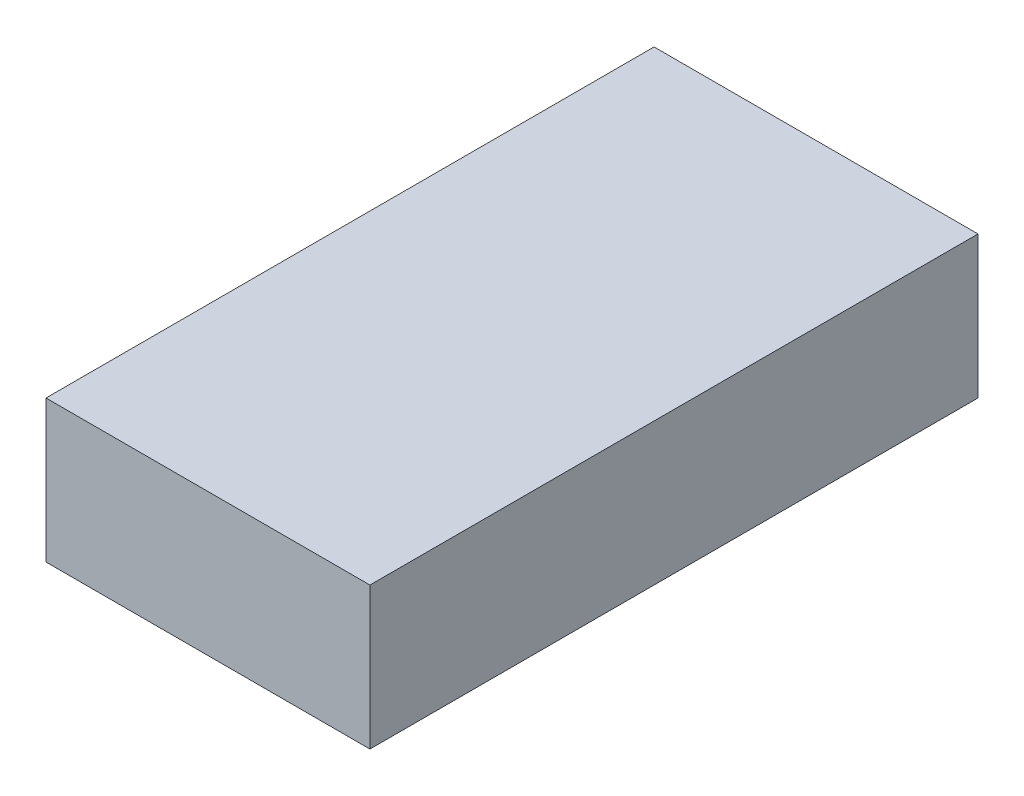
ISO-10303-21;
HEADER;
FILE_DESCRIPTION(('STEP AP214'),'2;1');
FILE_NAME('part.step','',(''),(''),'','','');
FILE_SCHEMA(('AUTOMOTIVE_DESIGN { 1 0 10303 214 1 1 1 1 }'));
ENDSEC;
DATA;
#1=APPLICATION_CONTEXT('core data for automotive mechanical design processes');
#2=APPLICATION_PROTOCOL_DEFINITION('international standard','automotive_design',2000,#1);
#3=PRODUCT_CONTEXT('',#1,'mechanical');
#4=PRODUCT('Part','Part','',(#3));
#5=PRODUCT_RELATED_PRODUCT_CATEGORY('part','',(#4));
#6=PRODUCT_DEFINITION_FORMATION('','',#4);
#7=PRODUCT_DEFINITION_CONTEXT('part definition',#1,'design');
#8=PRODUCT_DEFINITION('design','',#6,#7);
#9=PRODUCT_DEFINITION_SHAPE('','',#8);
#10=(LENGTH_UNIT() NAMED_UNIT(*) SI_UNIT(.MILLI.,.METRE.));
#11=(NAMED_UNIT(*) PLANE_ANGLE_UNIT() SI_UNIT($,.RADIAN.));
#12=(NAMED_UNIT(*) SI_UNIT($,.STERADIAN.) SOLID_ANGLE_UNIT());
#13=UNCERTAINTY_MEASURE_WITH_UNIT(LENGTH_MEASURE(1.E-05),#10,'distance_accuracy_value','');
#14=(GEOMETRIC_REPRESENTATION_CONTEXT(3) GLOBAL_UNCERTAINTY_ASSIGNED_CONTEXT((#13)) GLOBAL_UNIT_ASSIGNED_CONTEXT((#10,
#11,#12)) REPRESENTATION_CONTEXT('',''));
#15=CARTESIAN_POINT('',(0.,0.,0.));
#16=DIRECTION('',(0.,0.,1.));
#17=DIRECTION('',(1.,0.,0.));
#18=AXIS2_PLACEMENT_3D('',#15,#16,#17);
#19=CARTESIAN_POINT('',(-57.,-25.,214.));
#20=DIRECTION('',(1.,0.,0.));
#21=DIRECTION('',(0.,0.,-1.));
#22=AXIS2_PLACEMENT_3D('',#19,#20,#21);
#23=PLANE('',#22);
#24=DIRECTION('',(0.,-1.,0.));
#25=VECTOR('',#24,1.);
#26=CARTESIAN_POINT('',(-57.,-25.,0.));
#27=LINE('',#26,#25);
#28=CARTESIAN_POINT('',(-57.,25.,0.));
#29=VERTEX_POINT('',#28);
#30=CARTESIAN_POINT('',(-57.,-25.,0.));
#31=VERTEX_POINT('',#30);
#32=EDGE_CURVE('E96',#29,#31,#27,.T.);
#33=ORIENTED_EDGE('',*,*,#32,.T.);
#34=DIRECTION('',(0.,0.,-1.));
#35=VECTOR('',#34,1.);
#36=CARTESIAN_POINT('',(-57.,-25.,214.));
#37=LINE('',#36,#35);
#38=CARTESIAN_POINT('',(-57.,-25.,214.));
#39=VERTEX_POINT('',#38);
#40=EDGE_CURVE('E11',#39,#31,#37,.T.);
#41=ORIENTED_EDGE('',*,*,#40,.F.);
#42=DIRECTION('',(0.,-1.,0.));
#43=VECTOR('',#42,1.);
#44=CARTESIAN_POINT('',(-57.,-25.,214.));
#45=LINE('',#44,#43);
#46=CARTESIAN_POINT('',(-57.,25.,214.));
#47=VERTEX_POINT('',#46);
#48=EDGE_CURVE('E84',#47,#39,#45,.T.);
#49=ORIENTED_EDGE('',*,*,#48,.F.);
#50=DIRECTION('',(0.,0.,-1.));
#51=VECTOR('',#50,1.);
#52=CARTESIAN_POINT('',(-57.,25.,214.));
#53=LINE('',#52,#51);
#54=EDGE_CURVE('E92',#47,#29,#53,.T.);
#55=ORIENTED_EDGE('',*,*,#54,.T.);
#56=EDGE_LOOP('',(#33,#41,#49,#55));
#57=FACE_BOUND('',#56,.T.);
#58=ADVANCED_FACE('F33',(#57),#23,.F.);
#59=CARTESIAN_POINT('',(57.,-25.,214.));
#60=DIRECTION('',(0.,1.,0.));
#61=DIRECTION('',(-1.,0.,0.));
#62=AXIS2_PLACEMENT_3D('',#59,#60,#61);
#63=PLANE('',#62);
#64=DIRECTION('',(1.,0.,0.));
#65=VECTOR('',#64,1.);
#66=CARTESIAN_POINT('',(57.,-25.,0.));
#67=LINE('',#66,#65);
#68=CARTESIAN_POINT('',(57.,-25.,0.));
#69=VERTEX_POINT('',#68);
#70=EDGE_CURVE('E88',#31,#69,#67,.T.);
#71=ORIENTED_EDGE('',*,*,#70,.T.);
#72=DIRECTION('',(0.,0.,-1.));
#73=VECTOR('',#72,1.);
#74=CARTESIAN_POINT('',(57.,-25.,214.));
#75=LINE('',#74,#73);
#76=CARTESIAN_POINT('',(57.,-25.,214.));
#77=VERTEX_POINT('',#76);
#78=EDGE_CURVE('E41',#77,#69,#75,.T.);
#79=ORIENTED_EDGE('',*,*,#78,.F.);
#80=DIRECTION('',(1.,0.,0.));
#81=VECTOR('',#80,1.);
#82=CARTESIAN_POINT('',(57.,-25.,214.));
#83=LINE('',#82,#81);
#84=EDGE_CURVE('E79',#39,#77,#83,.T.);
#85=ORIENTED_EDGE('',*,*,#84,.F.);
#86=ORIENTED_EDGE('',*,*,#40,.T.);
#87=EDGE_LOOP('',(#71,#79,#85,#86));
#88=FACE_BOUND('',#87,.T.);
#89=ADVANCED_FACE('F87',(#88),#63,.F.);
#90=CARTESIAN_POINT('',(57.,-25.,214.));
#91=DIRECTION('',(-1.,0.,0.));
#92=DIRECTION('',(0.,0.,1.));
#93=AXIS2_PLACEMENT_3D('',#90,#91,#92);
#94=PLANE('',#93);
#95=DIRECTION('',(0.,1.,0.));
#96=VECTOR('',#95,1.);
#97=CARTESIAN_POINT('',(57.,-25.,0.));
#98=LINE('',#97,#96);
#99=CARTESIAN_POINT('',(57.,25.,0.));
#100=VERTEX_POINT('',#99);
#101=EDGE_CURVE('E66',#69,#100,#98,.T.);
#102=ORIENTED_EDGE('',*,*,#101,.T.);
#103=DIRECTION('',(0.,0.,-1.));
#104=VECTOR('',#103,1.);
#105=CARTESIAN_POINT('',(57.,25.,214.));
#106=LINE('',#105,#104);
#107=CARTESIAN_POINT('',(57.,25.,214.));
#108=VERTEX_POINT('',#107);
#109=EDGE_CURVE('E89',#108,#100,#106,.T.);
#110=ORIENTED_EDGE('',*,*,#109,.F.);
#111=DIRECTION('',(0.,1.,0.));
#112=VECTOR('',#111,1.);
#113=CARTESIAN_POINT('',(57.,-25.,214.));
#114=LINE('',#113,#112);
#115=EDGE_CURVE('E82',#77,#108,#114,.T.);
#116=ORIENTED_EDGE('',*,*,#115,.F.);
#117=ORIENTED_EDGE('',*,*,#78,.T.);
#118=EDGE_LOOP('',(#102,#110,#116,#117));
#119=FACE_BOUND('',#118,.T.);
#120=ADVANCED_FACE('F90',(#119),#94,.F.);
#121=CARTESIAN_POINT('',(57.,25.,214.));
#122=DIRECTION('',(0.,-1.,0.));
#123=DIRECTION('',(1.,0.,0.));
#124=AXIS2_PLACEMENT_3D('',#121,#122,#123);
#125=PLANE('',#124);
#126=DIRECTION('',(-1.,0.,0.));
#127=VECTOR('',#126,1.);
#128=CARTESIAN_POINT('',(57.,25.,0.));
#129=LINE('',#128,#127);
#130=EDGE_CURVE('E72',#100,#29,#129,.T.);
#131=ORIENTED_EDGE('',*,*,#130,.T.);
#132=ORIENTED_EDGE('',*,*,#54,.F.);
#133=DIRECTION('',(-1.,0.,0.));
#134=VECTOR('',#133,1.);
#135=CARTESIAN_POINT('',(57.,25.,214.));
#136=LINE('',#135,#134);
#137=EDGE_CURVE('E49',#108,#47,#136,.T.);
#138=ORIENTED_EDGE('',*,*,#137,.F.);
#139=ORIENTED_EDGE('',*,*,#109,.T.);
#140=EDGE_LOOP('',(#131,#132,#138,#139));
#141=FACE_BOUND('',#140,.T.);
#142=ADVANCED_FACE('F103',(#141),#125,.F.);
#143=CARTESIAN_POINT('',(0.,0.,214.));
#144=DIRECTION('',(0.,0.,1.));
#145=DIRECTION('',(1.,0.,0.));
#146=AXIS2_PLACEMENT_3D('',#143,#144,#145);
#147=PLANE('',#146);
#148=ORIENTED_EDGE('',*,*,#48,.T.);
#149=ORIENTED_EDGE('',*,*,#84,.T.);
#150=ORIENTED_EDGE('',*,*,#115,.T.);
#151=ORIENTED_EDGE('',*,*,#137,.T.);
#152=EDGE_LOOP('',(#148,#149,#150,#151));
#153=FACE_BOUND('',#152,.T.);
#154=ADVANCED_FACE('F80',(#153),#147,.T.);
#155=CARTESIAN_POINT('',(0.,0.,0.));
#156=DIRECTION('',(0.,0.,1.));
#157=DIRECTION('',(1.,0.,0.));
#158=AXIS2_PLACEMENT_3D('',#155,#156,#157);
#159=PLANE('',#158);
#160=ORIENTED_EDGE('',*,*,#32,.F.);
#161=ORIENTED_EDGE('',*,*,#130,.F.);
#162=ORIENTED_EDGE('',*,*,#101,.F.);
#163=ORIENTED_EDGE('',*,*,#70,.F.);
#164=EDGE_LOOP('',(#160,#161,#162,#163));
#165=FACE_BOUND('',#164,.T.);
#166=ADVANCED_FACE('F106',(#165),#159,.F.);
#167=CLOSED_SHELL('',(#58,#89,#120,#142,#154,#166));
#168=MANIFOLD_SOLID_BREP('B2',#167);
#169=ADVANCED_BREP_SHAPE_REPRESENTATION('',(#18,#168),#14);
#170=SHAPE_DEFINITION_REPRESENTATION(#9,#169);
ENDSEC;
END-ISO-10303-21;
